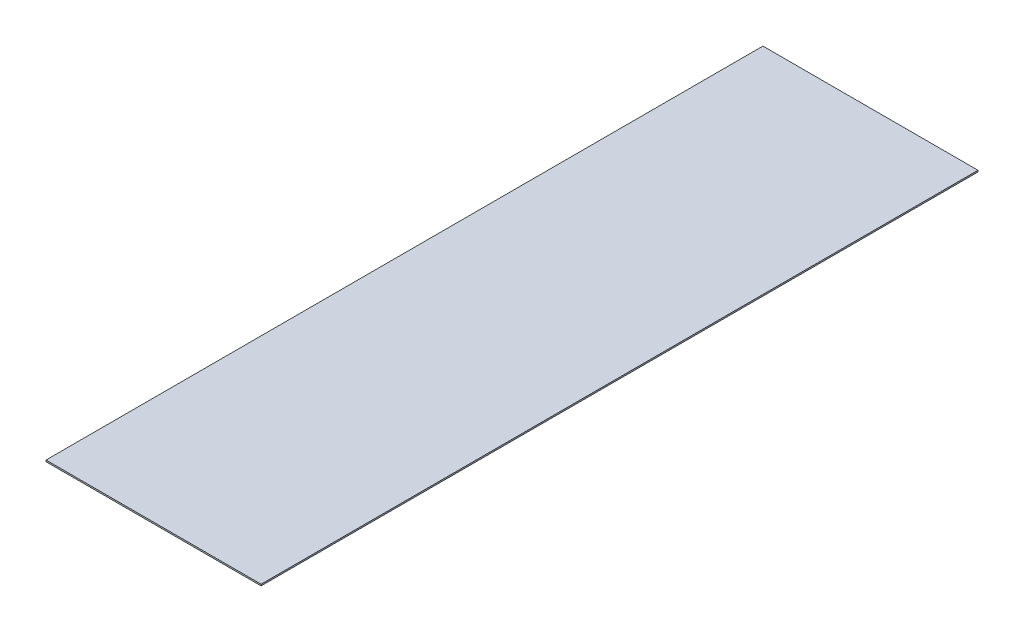
ISO-10303-21;
HEADER;
FILE_DESCRIPTION(('STEP AP214'),'2;1');
FILE_NAME('part.step','',(''),(''),'','','');
FILE_SCHEMA(('AUTOMOTIVE_DESIGN { 1 0 10303 214 1 1 1 1 }'));
ENDSEC;
DATA;
#1=APPLICATION_CONTEXT('core data for automotive mechanical design processes');
#2=APPLICATION_PROTOCOL_DEFINITION('international standard','automotive_design',2000,#1);
#3=PRODUCT_CONTEXT('',#1,'mechanical');
#4=PRODUCT('Part','Part','',(#3));
#5=PRODUCT_RELATED_PRODUCT_CATEGORY('part','',(#4));
#6=PRODUCT_DEFINITION_FORMATION('','',#4);
#7=PRODUCT_DEFINITION_CONTEXT('part definition',#1,'design');
#8=PRODUCT_DEFINITION('design','',#6,#7);
#9=PRODUCT_DEFINITION_SHAPE('','',#8);
#10=(LENGTH_UNIT() NAMED_UNIT(*) SI_UNIT(.MILLI.,.METRE.));
#11=(NAMED_UNIT(*) PLANE_ANGLE_UNIT() SI_UNIT($,.RADIAN.));
#12=(NAMED_UNIT(*) SI_UNIT($,.STERADIAN.) SOLID_ANGLE_UNIT());
#13=UNCERTAINTY_MEASURE_WITH_UNIT(LENGTH_MEASURE(1.E-05),#10,'distance_accuracy_value','');
#14=(GEOMETRIC_REPRESENTATION_CONTEXT(3) GLOBAL_UNCERTAINTY_ASSIGNED_CONTEXT((#13)) GLOBAL_UNIT_ASSIGNED_CONTEXT((#10,
#11,#12)) REPRESENTATION_CONTEXT('',''));
#15=CARTESIAN_POINT('',(0.,0.,0.));
#16=DIRECTION('',(0.,0.,1.));
#17=DIRECTION('',(1.,0.,0.));
#18=AXIS2_PLACEMENT_3D('',#15,#16,#17);
#19=CARTESIAN_POINT('',(457.2,6.4,1524.));
#20=DIRECTION('',(-1.,0.,0.));
#21=DIRECTION('',(0.,0.,1.));
#22=AXIS2_PLACEMENT_3D('',#19,#20,#21);
#23=PLANE('',#22);
#24=DIRECTION('',(0.,0.,-1.));
#25=VECTOR('',#24,1.);
#26=CARTESIAN_POINT('',(457.2,0.,1524.));
#27=LINE('',#26,#25);
#28=CARTESIAN_POINT('',(457.2,0.,1524.));
#29=VERTEX_POINT('',#28);
#30=CARTESIAN_POINT('',(457.2,0.,-1524.));
#31=VERTEX_POINT('',#30);
#32=EDGE_CURVE('E96',#29,#31,#27,.T.);
#33=ORIENTED_EDGE('',*,*,#32,.T.);
#34=DIRECTION('',(0.,-1.,0.));
#35=VECTOR('',#34,1.);
#36=CARTESIAN_POINT('',(457.2,6.4,-1524.));
#37=LINE('',#36,#35);
#38=CARTESIAN_POINT('',(457.2,6.4,-1524.));
#39=VERTEX_POINT('',#38);
#40=EDGE_CURVE('E11',#39,#31,#37,.T.);
#41=ORIENTED_EDGE('',*,*,#40,.F.);
#42=DIRECTION('',(0.,0.,-1.));
#43=VECTOR('',#42,1.);
#44=CARTESIAN_POINT('',(457.2,6.4,1524.));
#45=LINE('',#44,#43);
#46=CARTESIAN_POINT('',(457.2,6.4,1524.));
#47=VERTEX_POINT('',#46);
#48=EDGE_CURVE('E84',#47,#39,#45,.T.);
#49=ORIENTED_EDGE('',*,*,#48,.F.);
#50=DIRECTION('',(0.,-1.,0.));
#51=VECTOR('',#50,1.);
#52=CARTESIAN_POINT('',(457.2,6.4,1524.));
#53=LINE('',#52,#51);
#54=EDGE_CURVE('E92',#47,#29,#53,.T.);
#55=ORIENTED_EDGE('',*,*,#54,.T.);
#56=EDGE_LOOP('',(#33,#41,#49,#55));
#57=FACE_BOUND('',#56,.T.);
#58=ADVANCED_FACE('F33',(#57),#23,.F.);
#59=CARTESIAN_POINT('',(-457.2,6.4,-1524.));
#60=DIRECTION('',(0.,0.,1.));
#61=DIRECTION('',(1.,0.,0.));
#62=AXIS2_PLACEMENT_3D('',#59,#60,#61);
#63=PLANE('',#62);
#64=DIRECTION('',(-1.,0.,0.));
#65=VECTOR('',#64,1.);
#66=CARTESIAN_POINT('',(-457.2,0.,-1524.));
#67=LINE('',#66,#65);
#68=CARTESIAN_POINT('',(-457.2,0.,-1524.));
#69=VERTEX_POINT('',#68);
#70=EDGE_CURVE('E88',#31,#69,#67,.T.);
#71=ORIENTED_EDGE('',*,*,#70,.T.);
#72=DIRECTION('',(0.,-1.,0.));
#73=VECTOR('',#72,1.);
#74=CARTESIAN_POINT('',(-457.2,6.4,-1524.));
#75=LINE('',#74,#73);
#76=CARTESIAN_POINT('',(-457.2,6.4,-1524.));
#77=VERTEX_POINT('',#76);
#78=EDGE_CURVE('E41',#77,#69,#75,.T.);
#79=ORIENTED_EDGE('',*,*,#78,.F.);
#80=DIRECTION('',(-1.,0.,0.));
#81=VECTOR('',#80,1.);
#82=CARTESIAN_POINT('',(-457.2,6.4,-1524.));
#83=LINE('',#82,#81);
#84=EDGE_CURVE('E79',#39,#77,#83,.T.);
#85=ORIENTED_EDGE('',*,*,#84,.F.);
#86=ORIENTED_EDGE('',*,*,#40,.T.);
#87=EDGE_LOOP('',(#71,#79,#85,#86));
#88=FACE_BOUND('',#87,.T.);
#89=ADVANCED_FACE('F87',(#88),#63,.F.);
#90=CARTESIAN_POINT('',(-457.2,6.4,1524.));
#91=DIRECTION('',(1.,0.,0.));
#92=DIRECTION('',(0.,0.,-1.));
#93=AXIS2_PLACEMENT_3D('',#90,#91,#92);
#94=PLANE('',#93);
#95=DIRECTION('',(0.,0.,1.));
#96=VECTOR('',#95,1.);
#97=CARTESIAN_POINT('',(-457.2,0.,1524.));
#98=LINE('',#97,#96);
#99=CARTESIAN_POINT('',(-457.2,0.,1524.));
#100=VERTEX_POINT('',#99);
#101=EDGE_CURVE('E66',#69,#100,#98,.T.);
#102=ORIENTED_EDGE('',*,*,#101,.T.);
#103=DIRECTION('',(0.,-1.,0.));
#104=VECTOR('',#103,1.);
#105=CARTESIAN_POINT('',(-457.2,6.4,1524.));
#106=LINE('',#105,#104);
#107=CARTESIAN_POINT('',(-457.2,6.4,1524.));
#108=VERTEX_POINT('',#107);
#109=EDGE_CURVE('E89',#108,#100,#106,.T.);
#110=ORIENTED_EDGE('',*,*,#109,.F.);
#111=DIRECTION('',(0.,0.,1.));
#112=VECTOR('',#111,1.);
#113=CARTESIAN_POINT('',(-457.2,6.4,1524.));
#114=LINE('',#113,#112);
#115=EDGE_CURVE('E82',#77,#108,#114,.T.);
#116=ORIENTED_EDGE('',*,*,#115,.F.);
#117=ORIENTED_EDGE('',*,*,#78,.T.);
#118=EDGE_LOOP('',(#102,#110,#116,#117));
#119=FACE_BOUND('',#118,.T.);
#120=ADVANCED_FACE('F90',(#119),#94,.F.);
#121=CARTESIAN_POINT('',(-457.2,6.4,1524.));
#122=DIRECTION('',(0.,0.,-1.));
#123=DIRECTION('',(-1.,0.,0.));
#124=AXIS2_PLACEMENT_3D('',#121,#122,#123);
#125=PLANE('',#124);
#126=DIRECTION('',(1.,0.,0.));
#127=VECTOR('',#126,1.);
#128=CARTESIAN_POINT('',(-457.2,0.,1524.));
#129=LINE('',#128,#127);
#130=EDGE_CURVE('E72',#100,#29,#129,.T.);
#131=ORIENTED_EDGE('',*,*,#130,.T.);
#132=ORIENTED_EDGE('',*,*,#54,.F.);
#133=DIRECTION('',(1.,0.,0.));
#134=VECTOR('',#133,1.);
#135=CARTESIAN_POINT('',(-457.2,6.4,1524.));
#136=LINE('',#135,#134);
#137=EDGE_CURVE('E49',#108,#47,#136,.T.);
#138=ORIENTED_EDGE('',*,*,#137,.F.);
#139=ORIENTED_EDGE('',*,*,#109,.T.);
#140=EDGE_LOOP('',(#131,#132,#138,#139));
#141=FACE_BOUND('',#140,.T.);
#142=ADVANCED_FACE('F103',(#141),#125,.F.);
#143=CARTESIAN_POINT('',(0.,6.4,0.));
#144=DIRECTION('',(0.,-1.,0.));
#145=DIRECTION('',(0.,0.,-1.));
#146=AXIS2_PLACEMENT_3D('',#143,#144,#145);
#147=PLANE('',#146);
#148=ORIENTED_EDGE('',*,*,#48,.T.);
#149=ORIENTED_EDGE('',*,*,#84,.T.);
#150=ORIENTED_EDGE('',*,*,#115,.T.);
#151=ORIENTED_EDGE('',*,*,#137,.T.);
#152=EDGE_LOOP('',(#148,#149,#150,#151));
#153=FACE_BOUND('',#152,.T.);
#154=ADVANCED_FACE('F80',(#153),#147,.F.);
#155=CARTESIAN_POINT('',(0.,0.,0.));
#156=DIRECTION('',(0.,-1.,0.));
#157=DIRECTION('',(0.,0.,-1.));
#158=AXIS2_PLACEMENT_3D('',#155,#156,#157);
#159=PLANE('',#158);
#160=ORIENTED_EDGE('',*,*,#32,.F.);
#161=ORIENTED_EDGE('',*,*,#130,.F.);
#162=ORIENTED_EDGE('',*,*,#101,.F.);
#163=ORIENTED_EDGE('',*,*,#70,.F.);
#164=EDGE_LOOP('',(#160,#161,#162,#163));
#165=FACE_BOUND('',#164,.T.);
#166=ADVANCED_FACE('F106',(#165),#159,.T.);
#167=CLOSED_SHELL('',(#58,#89,#120,#142,#154,#166));
#168=MANIFOLD_SOLID_BREP('B2',#167);
#169=ADVANCED_BREP_SHAPE_REPRESENTATION('',(#18,#168),#14);
#170=SHAPE_DEFINITION_REPRESENTATION(#9,#169);
ENDSEC;
END-ISO-10303-21;
